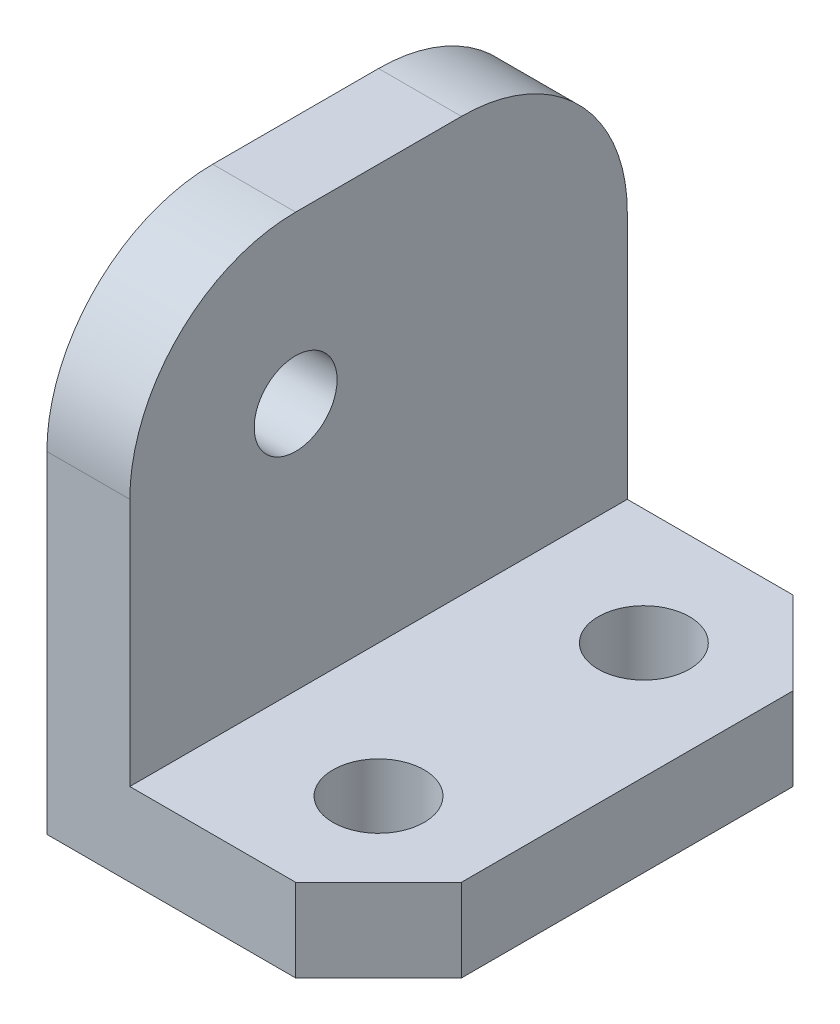
ISO-10303-21;
HEADER;
FILE_DESCRIPTION(('STEP AP214'),'2;1');
FILE_NAME('part.step','',(''),(''),'','','');
FILE_SCHEMA(('AUTOMOTIVE_DESIGN { 1 0 10303 214 1 1 1 1 }'));
ENDSEC;
DATA;
#1=APPLICATION_CONTEXT('core data for automotive mechanical design processes');
#2=APPLICATION_PROTOCOL_DEFINITION('international standard','automotive_design',2000,#1);
#3=PRODUCT_CONTEXT('',#1,'mechanical');
#4=PRODUCT('Part','Part','',(#3));
#5=PRODUCT_RELATED_PRODUCT_CATEGORY('part','',(#4));
#6=PRODUCT_DEFINITION_FORMATION('','',#4);
#7=PRODUCT_DEFINITION_CONTEXT('part definition',#1,'design');
#8=PRODUCT_DEFINITION('design','',#6,#7);
#9=PRODUCT_DEFINITION_SHAPE('','',#8);
#10=(LENGTH_UNIT() NAMED_UNIT(*) SI_UNIT(.MILLI.,.METRE.));
#11=(NAMED_UNIT(*) PLANE_ANGLE_UNIT() SI_UNIT($,.RADIAN.));
#12=(NAMED_UNIT(*) SI_UNIT($,.STERADIAN.) SOLID_ANGLE_UNIT());
#13=UNCERTAINTY_MEASURE_WITH_UNIT(LENGTH_MEASURE(1.E-05),#10,'distance_accuracy_value','');
#14=(GEOMETRIC_REPRESENTATION_CONTEXT(3) GLOBAL_UNCERTAINTY_ASSIGNED_CONTEXT((#13)) GLOBAL_UNIT_ASSIGNED_CONTEXT((#10,
#11,#12)) REPRESENTATION_CONTEXT('',''));
#15=CARTESIAN_POINT('',(0.,0.,0.));
#16=DIRECTION('',(0.,0.,1.));
#17=DIRECTION('',(1.,0.,0.));
#18=AXIS2_PLACEMENT_3D('',#15,#16,#17);
#19=CARTESIAN_POINT('',(20.,0.,30.));
#20=DIRECTION('',(0.,1.,0.));
#21=DIRECTION('',(-1.,0.,0.));
#22=AXIS2_PLACEMENT_3D('',#19,#20,#21);
#23=PLANE('',#22);
#24=CARTESIAN_POINT('',(13.,0.,7.));
#25=DIRECTION('',(0.,1.,0.));
#26=DIRECTION('',(0.,0.,1.));
#27=AXIS2_PLACEMENT_3D('',#24,#25,#26);
#28=CIRCLE('',#27,2.75);
#29=CARTESIAN_POINT('',(13.,0.,9.75));
#30=VERTEX_POINT('',#29);
#31=EDGE_CURVE('E168',#30,#30,#28,.T.);
#32=ORIENTED_EDGE('',*,*,#31,.T.);
#33=EDGE_LOOP('',(#32));
#34=FACE_BOUND('',#33,.T.);
#35=CARTESIAN_POINT('',(13.,0.,23.));
#36=DIRECTION('',(0.,1.,0.));
#37=DIRECTION('',(0.,0.,1.));
#38=AXIS2_PLACEMENT_3D('',#35,#36,#37);
#39=CIRCLE('',#38,2.75);
#40=CARTESIAN_POINT('',(13.,0.,25.75));
#41=VERTEX_POINT('',#40);
#42=EDGE_CURVE('E176',#41,#41,#39,.T.);
#43=ORIENTED_EDGE('',*,*,#42,.T.);
#44=EDGE_LOOP('',(#43));
#45=FACE_BOUND('',#44,.T.);
#46=DIRECTION('',(1.,0.,0.));
#47=VECTOR('',#46,1.);
#48=CARTESIAN_POINT('',(20.,0.,0.));
#49=LINE('',#48,#47);
#50=CARTESIAN_POINT('',(0.,0.,0.));
#51=VERTEX_POINT('',#50);
#52=CARTESIAN_POINT('',(15.,0.,0.));
#53=VERTEX_POINT('',#52);
#54=EDGE_CURVE('E188',#51,#53,#49,.T.);
#55=ORIENTED_EDGE('',*,*,#54,.T.);
#56=DIRECTION('',(0.707106781186549,0.,0.707106781186547));
#57=VECTOR('',#56,1.);
#58=CARTESIAN_POINT('',(20.,0.,5.));
#59=LINE('',#58,#57);
#60=CARTESIAN_POINT('',(20.,0.,5.));
#61=VERTEX_POINT('',#60);
#62=EDGE_CURVE('E55',#53,#61,#59,.T.);
#63=ORIENTED_EDGE('',*,*,#62,.T.);
#64=DIRECTION('',(0.,0.,-1.));
#65=VECTOR('',#64,1.);
#66=CARTESIAN_POINT('',(20.,0.,30.));
#67=LINE('',#66,#65);
#68=CARTESIAN_POINT('',(20.,0.,25.));
#69=VERTEX_POINT('',#68);
#70=EDGE_CURVE('E225',#69,#61,#67,.T.);
#71=ORIENTED_EDGE('',*,*,#70,.F.);
#72=DIRECTION('',(0.707106781186546,0.,-0.707106781186549));
#73=VECTOR('',#72,1.);
#74=CARTESIAN_POINT('',(15.,0.,30.));
#75=LINE('',#74,#73);
#76=CARTESIAN_POINT('',(15.,0.,30.));
#77=VERTEX_POINT('',#76);
#78=EDGE_CURVE('E62',#69,#77,#75,.F.);
#79=ORIENTED_EDGE('',*,*,#78,.T.);
#80=DIRECTION('',(1.,0.,0.));
#81=VECTOR('',#80,1.);
#82=CARTESIAN_POINT('',(20.,0.,30.));
#83=LINE('',#82,#81);
#84=CARTESIAN_POINT('',(0.,0.,30.));
#85=VERTEX_POINT('',#84);
#86=EDGE_CURVE('E189',#85,#77,#83,.T.);
#87=ORIENTED_EDGE('',*,*,#86,.F.);
#88=DIRECTION('',(0.,0.,-1.));
#89=VECTOR('',#88,1.);
#90=CARTESIAN_POINT('',(0.,0.,30.));
#91=LINE('',#90,#89);
#92=EDGE_CURVE('E202',#85,#51,#91,.T.);
#93=ORIENTED_EDGE('',*,*,#92,.T.);
#94=EDGE_LOOP('',(#55,#63,#71,#79,#87,#93));
#95=FACE_BOUND('',#94,.T.);
#96=ADVANCED_FACE('F45',(#34,#45,#95),#23,.F.);
#97=CARTESIAN_POINT('',(20.,5.,30.));
#98=DIRECTION('',(-1.,0.,0.));
#99=DIRECTION('',(0.,0.,1.));
#100=AXIS2_PLACEMENT_3D('',#97,#98,#99);
#101=PLANE('',#100);
#102=ORIENTED_EDGE('',*,*,#70,.T.);
#103=DIRECTION('',(0.,1.,0.));
#104=VECTOR('',#103,1.);
#105=CARTESIAN_POINT('',(20.,5.,5.));
#106=LINE('',#105,#104);
#107=CARTESIAN_POINT('',(20.,5.,5.));
#108=VERTEX_POINT('',#107);
#109=EDGE_CURVE('E244',#61,#108,#106,.T.);
#110=ORIENTED_EDGE('',*,*,#109,.T.);
#111=DIRECTION('',(0.,0.,-1.));
#112=VECTOR('',#111,1.);
#113=CARTESIAN_POINT('',(20.,5.,30.));
#114=LINE('',#113,#112);
#115=CARTESIAN_POINT('',(20.,5.,25.));
#116=VERTEX_POINT('',#115);
#117=EDGE_CURVE('E221',#116,#108,#114,.T.);
#118=ORIENTED_EDGE('',*,*,#117,.F.);
#119=DIRECTION('',(0.,-1.,0.));
#120=VECTOR('',#119,1.);
#121=CARTESIAN_POINT('',(20.,5.,25.));
#122=LINE('',#121,#120);
#123=EDGE_CURVE('E241',#116,#69,#122,.T.);
#124=ORIENTED_EDGE('',*,*,#123,.T.);
#125=EDGE_LOOP('',(#102,#110,#118,#124));
#126=FACE_BOUND('',#125,.T.);
#127=ADVANCED_FACE('F262',(#126),#101,.F.);
#128=CARTESIAN_POINT('',(5.,5.,30.));
#129=DIRECTION('',(0.,-1.,0.));
#130=DIRECTION('',(0.,0.,-1.));
#131=AXIS2_PLACEMENT_3D('',#128,#129,#130);
#132=PLANE('',#131);
#133=CARTESIAN_POINT('',(13.,5.,7.));
#134=DIRECTION('',(0.,1.,0.));
#135=DIRECTION('',(0.,0.,1.));
#136=AXIS2_PLACEMENT_3D('',#133,#134,#135);
#137=CIRCLE('',#136,2.75);
#138=CARTESIAN_POINT('',(13.,5.,9.75));
#139=VERTEX_POINT('',#138);
#140=EDGE_CURVE('E163',#139,#139,#137,.T.);
#141=ORIENTED_EDGE('',*,*,#140,.F.);
#142=EDGE_LOOP('',(#141));
#143=FACE_BOUND('',#142,.T.);
#144=CARTESIAN_POINT('',(13.,5.,23.));
#145=DIRECTION('',(0.,1.,0.));
#146=DIRECTION('',(0.,0.,1.));
#147=AXIS2_PLACEMENT_3D('',#144,#145,#146);
#148=CIRCLE('',#147,2.75);
#149=CARTESIAN_POINT('',(13.,5.,25.75));
#150=VERTEX_POINT('',#149);
#151=EDGE_CURVE('E172',#150,#150,#148,.T.);
#152=ORIENTED_EDGE('',*,*,#151,.F.);
#153=EDGE_LOOP('',(#152));
#154=FACE_BOUND('',#153,.T.);
#155=ORIENTED_EDGE('',*,*,#117,.T.);
#156=DIRECTION('',(-0.707106781186549,0.,-0.707106781186547));
#157=VECTOR('',#156,1.);
#158=CARTESIAN_POINT('',(20.,5.,5.));
#159=LINE('',#158,#157);
#160=CARTESIAN_POINT('',(15.,5.,0.));
#161=VERTEX_POINT('',#160);
#162=EDGE_CURVE('E251',#108,#161,#159,.T.);
#163=ORIENTED_EDGE('',*,*,#162,.T.);
#164=DIRECTION('',(-1.,0.,0.));
#165=VECTOR('',#164,1.);
#166=CARTESIAN_POINT('',(5.,5.,0.));
#167=LINE('',#166,#165);
#168=CARTESIAN_POINT('',(5.,5.,0.));
#169=VERTEX_POINT('',#168);
#170=EDGE_CURVE('E205',#161,#169,#167,.T.);
#171=ORIENTED_EDGE('',*,*,#170,.T.);
#172=DIRECTION('',(0.,0.,-1.));
#173=VECTOR('',#172,1.);
#174=CARTESIAN_POINT('',(5.,5.,30.));
#175=LINE('',#174,#173);
#176=CARTESIAN_POINT('',(5.,5.,30.));
#177=VERTEX_POINT('',#176);
#178=EDGE_CURVE('E217',#177,#169,#175,.T.);
#179=ORIENTED_EDGE('',*,*,#178,.F.);
#180=DIRECTION('',(-1.,0.,0.));
#181=VECTOR('',#180,1.);
#182=CARTESIAN_POINT('',(5.,5.,30.));
#183=LINE('',#182,#181);
#184=CARTESIAN_POINT('',(15.,5.,30.));
#185=VERTEX_POINT('',#184);
#186=EDGE_CURVE('E192',#185,#177,#183,.T.);
#187=ORIENTED_EDGE('',*,*,#186,.F.);
#188=DIRECTION('',(-0.707106781186546,0.,0.707106781186549));
#189=VECTOR('',#188,1.);
#190=CARTESIAN_POINT('',(15.,5.,30.));
#191=LINE('',#190,#189);
#192=EDGE_CURVE('E248',#185,#116,#191,.F.);
#193=ORIENTED_EDGE('',*,*,#192,.T.);
#194=EDGE_LOOP('',(#155,#163,#171,#179,#187,#193));
#195=FACE_BOUND('',#194,.T.);
#196=ADVANCED_FACE('F267',(#143,#154,#195),#132,.F.);
#197=CARTESIAN_POINT('',(5.,38.,30.));
#198=DIRECTION('',(-1.,0.,0.));
#199=DIRECTION('',(0.,-1.,0.));
#200=AXIS2_PLACEMENT_3D('',#197,#198,#199);
#201=PLANE('',#200);
#202=CARTESIAN_POINT('',(5.,20.,20.));
#203=DIRECTION('',(1.,0.,0.));
#204=DIRECTION('',(0.,0.,-1.));
#205=AXIS2_PLACEMENT_3D('',#202,#203,#204);
#206=CIRCLE('',#205,2.5);
#207=CARTESIAN_POINT('',(5.,20.,17.5));
#208=VERTEX_POINT('',#207);
#209=EDGE_CURVE('E180',#208,#208,#206,.T.);
#210=ORIENTED_EDGE('',*,*,#209,.F.);
#211=EDGE_LOOP('',(#210));
#212=FACE_BOUND('',#211,.T.);
#213=DIRECTION('',(0.,1.,0.));
#214=VECTOR('',#213,1.);
#215=CARTESIAN_POINT('',(5.,38.,0.));
#216=LINE('',#215,#214);
#217=CARTESIAN_POINT('',(5.,20.,0.));
#218=VERTEX_POINT('',#217);
#219=EDGE_CURVE('E208',#169,#218,#216,.T.);
#220=ORIENTED_EDGE('',*,*,#219,.T.);
#221=CARTESIAN_POINT('',(5.,20.,10.));
#222=DIRECTION('',(-1.,0.,0.));
#223=DIRECTION('',(0.,-1.,0.));
#224=AXIS2_PLACEMENT_3D('',#221,#222,#223);
#225=CIRCLE('',#224,10.);
#226=CARTESIAN_POINT('',(5.,30.,10.));
#227=VERTEX_POINT('',#226);
#228=EDGE_CURVE('E233',#218,#227,#225,.F.);
#229=ORIENTED_EDGE('',*,*,#228,.T.);
#230=DIRECTION('',(0.,0.,-1.));
#231=VECTOR('',#230,1.);
#232=CARTESIAN_POINT('',(5.,30.,20.));
#233=LINE('',#232,#231);
#234=CARTESIAN_POINT('',(5.,30.,20.));
#235=VERTEX_POINT('',#234);
#236=EDGE_CURVE('E155',#235,#227,#233,.T.);
#237=ORIENTED_EDGE('',*,*,#236,.F.);
#238=CARTESIAN_POINT('',(5.,20.,20.));
#239=DIRECTION('',(-1.,0.,0.));
#240=DIRECTION('',(0.,1.,0.));
#241=AXIS2_PLACEMENT_3D('',#238,#239,#240);
#242=CIRCLE('',#241,10.);
#243=CARTESIAN_POINT('',(5.,20.,30.));
#244=VERTEX_POINT('',#243);
#245=EDGE_CURVE('E134',#244,#235,#242,.T.);
#246=ORIENTED_EDGE('',*,*,#245,.F.);
#247=DIRECTION('',(0.,1.,0.));
#248=VECTOR('',#247,1.);
#249=CARTESIAN_POINT('',(5.,38.,30.));
#250=LINE('',#249,#248);
#251=EDGE_CURVE('E196',#177,#244,#250,.T.);
#252=ORIENTED_EDGE('',*,*,#251,.F.);
#253=ORIENTED_EDGE('',*,*,#178,.T.);
#254=EDGE_LOOP('',(#220,#229,#237,#246,#252,#253));
#255=FACE_BOUND('',#254,.T.);
#256=ADVANCED_FACE('F274',(#212,#255),#201,.F.);
#257=CARTESIAN_POINT('',(0.,0.,30.));
#258=DIRECTION('',(1.,0.,0.));
#259=DIRECTION('',(0.,0.,-1.));
#260=AXIS2_PLACEMENT_3D('',#257,#258,#259);
#261=PLANE('',#260);
#262=CARTESIAN_POINT('',(0.,20.,20.));
#263=DIRECTION('',(1.,0.,0.));
#264=DIRECTION('',(0.,0.,-1.));
#265=AXIS2_PLACEMENT_3D('',#262,#263,#264);
#266=CIRCLE('',#265,2.5);
#267=CARTESIAN_POINT('',(0.,20.,17.5));
#268=VERTEX_POINT('',#267);
#269=EDGE_CURVE('E184',#268,#268,#266,.T.);
#270=ORIENTED_EDGE('',*,*,#269,.T.);
#271=EDGE_LOOP('',(#270));
#272=FACE_BOUND('',#271,.T.);
#273=DIRECTION('',(0.,0.,-1.));
#274=VECTOR('',#273,1.);
#275=CARTESIAN_POINT('',(0.,30.,20.));
#276=LINE('',#275,#274);
#277=CARTESIAN_POINT('',(0.,30.,20.));
#278=VERTEX_POINT('',#277);
#279=CARTESIAN_POINT('',(0.,30.,10.));
#280=VERTEX_POINT('',#279);
#281=EDGE_CURVE('E140',#278,#280,#276,.T.);
#282=ORIENTED_EDGE('',*,*,#281,.T.);
#283=CARTESIAN_POINT('',(0.,20.,10.));
#284=DIRECTION('',(1.,0.,0.));
#285=DIRECTION('',(0.,0.,-1.));
#286=AXIS2_PLACEMENT_3D('',#283,#284,#285);
#287=CIRCLE('',#286,10.);
#288=CARTESIAN_POINT('',(0.,20.,0.));
#289=VERTEX_POINT('',#288);
#290=EDGE_CURVE('E238',#280,#289,#287,.F.);
#291=ORIENTED_EDGE('',*,*,#290,.T.);
#292=DIRECTION('',(0.,-1.,0.));
#293=VECTOR('',#292,1.);
#294=CARTESIAN_POINT('',(0.,0.,0.));
#295=LINE('',#294,#293);
#296=EDGE_CURVE('E193',#289,#51,#295,.T.);
#297=ORIENTED_EDGE('',*,*,#296,.T.);
#298=ORIENTED_EDGE('',*,*,#92,.F.);
#299=DIRECTION('',(0.,-1.,0.));
#300=VECTOR('',#299,1.);
#301=CARTESIAN_POINT('',(0.,0.,30.));
#302=LINE('',#301,#300);
#303=CARTESIAN_POINT('',(0.,20.,30.));
#304=VERTEX_POINT('',#303);
#305=EDGE_CURVE('E153',#304,#85,#302,.T.);
#306=ORIENTED_EDGE('',*,*,#305,.F.);
#307=CARTESIAN_POINT('',(0.,20.,20.));
#308=DIRECTION('',(-1.,0.,0.));
#309=DIRECTION('',(0.,1.,0.));
#310=AXIS2_PLACEMENT_3D('',#307,#308,#309);
#311=CIRCLE('',#310,10.);
#312=EDGE_CURVE('E131',#304,#278,#311,.T.);
#313=ORIENTED_EDGE('',*,*,#312,.T.);
#314=EDGE_LOOP('',(#282,#291,#297,#298,#306,#313));
#315=FACE_BOUND('',#314,.T.);
#316=ADVANCED_FACE('F151',(#272,#315),#261,.F.);
#317=CARTESIAN_POINT('',(0.,0.,30.));
#318=DIRECTION('',(0.,0.,-1.));
#319=DIRECTION('',(-1.,0.,0.));
#320=AXIS2_PLACEMENT_3D('',#317,#318,#319);
#321=PLANE('',#320);
#322=ORIENTED_EDGE('',*,*,#86,.T.);
#323=DIRECTION('',(0.,1.,0.));
#324=VECTOR('',#323,1.);
#325=CARTESIAN_POINT('',(15.,0.,30.));
#326=LINE('',#325,#324);
#327=EDGE_CURVE('E11',#77,#185,#326,.T.);
#328=ORIENTED_EDGE('',*,*,#327,.T.);
#329=ORIENTED_EDGE('',*,*,#186,.T.);
#330=ORIENTED_EDGE('',*,*,#251,.T.);
#331=DIRECTION('',(1.,0.,0.));
#332=VECTOR('',#331,1.);
#333=CARTESIAN_POINT('',(0.,20.,30.));
#334=LINE('',#333,#332);
#335=EDGE_CURVE('E139',#304,#244,#334,.T.);
#336=ORIENTED_EDGE('',*,*,#335,.F.);
#337=ORIENTED_EDGE('',*,*,#305,.T.);
#338=EDGE_LOOP('',(#322,#328,#329,#330,#336,#337));
#339=FACE_BOUND('',#338,.T.);
#340=ADVANCED_FACE('F278',(#339),#321,.F.);
#341=CARTESIAN_POINT('',(0.,0.,0.));
#342=DIRECTION('',(0.,0.,-1.));
#343=DIRECTION('',(-1.,0.,0.));
#344=AXIS2_PLACEMENT_3D('',#341,#342,#343);
#345=PLANE('',#344);
#346=ORIENTED_EDGE('',*,*,#170,.F.);
#347=DIRECTION('',(0.,-1.,0.));
#348=VECTOR('',#347,1.);
#349=CARTESIAN_POINT('',(15.,0.,0.));
#350=LINE('',#349,#348);
#351=EDGE_CURVE('E70',#161,#53,#350,.T.);
#352=ORIENTED_EDGE('',*,*,#351,.T.);
#353=ORIENTED_EDGE('',*,*,#54,.F.);
#354=ORIENTED_EDGE('',*,*,#296,.F.);
#355=DIRECTION('',(1.,0.,0.));
#356=VECTOR('',#355,1.);
#357=CARTESIAN_POINT('',(5.,20.,0.));
#358=LINE('',#357,#356);
#359=EDGE_CURVE('E229',#289,#218,#358,.T.);
#360=ORIENTED_EDGE('',*,*,#359,.T.);
#361=ORIENTED_EDGE('',*,*,#219,.F.);
#362=EDGE_LOOP('',(#346,#352,#353,#354,#360,#361));
#363=FACE_BOUND('',#362,.T.);
#364=ADVANCED_FACE('F270',(#363),#345,.T.);
#365=CARTESIAN_POINT('',(5.,20.,20.));
#366=DIRECTION('',(1.,0.,0.));
#367=DIRECTION('',(0.,0.,-1.));
#368=AXIS2_PLACEMENT_3D('',#365,#366,#367);
#369=CYLINDRICAL_SURFACE('',#368,2.5);
#370=ORIENTED_EDGE('',*,*,#269,.F.);
#371=EDGE_LOOP('',(#370));
#372=FACE_BOUND('',#371,.T.);
#373=ORIENTED_EDGE('',*,*,#209,.T.);
#374=EDGE_LOOP('',(#373));
#375=FACE_BOUND('',#374,.T.);
#376=ADVANCED_FACE('F319',(#372,#375),#369,.F.);
#377=CARTESIAN_POINT('',(13.,5.,23.));
#378=DIRECTION('',(0.,1.,0.));
#379=DIRECTION('',(0.,0.,1.));
#380=AXIS2_PLACEMENT_3D('',#377,#378,#379);
#381=CYLINDRICAL_SURFACE('',#380,2.75);
#382=ORIENTED_EDGE('',*,*,#42,.F.);
#383=EDGE_LOOP('',(#382));
#384=FACE_BOUND('',#383,.T.);
#385=ORIENTED_EDGE('',*,*,#151,.T.);
#386=EDGE_LOOP('',(#385));
#387=FACE_BOUND('',#386,.T.);
#388=ADVANCED_FACE('F315',(#384,#387),#381,.F.);
#389=CARTESIAN_POINT('',(13.,5.,7.));
#390=DIRECTION('',(0.,1.,0.));
#391=DIRECTION('',(0.,0.,1.));
#392=AXIS2_PLACEMENT_3D('',#389,#390,#391);
#393=CYLINDRICAL_SURFACE('',#392,2.75);
#394=ORIENTED_EDGE('',*,*,#31,.F.);
#395=EDGE_LOOP('',(#394));
#396=FACE_BOUND('',#395,.T.);
#397=ORIENTED_EDGE('',*,*,#140,.T.);
#398=EDGE_LOOP('',(#397));
#399=FACE_BOUND('',#398,.T.);
#400=ADVANCED_FACE('F310',(#396,#399),#393,.F.);
#401=CARTESIAN_POINT('',(0.,20.,20.));
#402=DIRECTION('',(1.,0.,0.));
#403=DIRECTION('',(0.,1.,0.));
#404=AXIS2_PLACEMENT_3D('',#401,#402,#403);
#405=CYLINDRICAL_SURFACE('',#404,10.);
#406=ORIENTED_EDGE('',*,*,#245,.T.);
#407=DIRECTION('',(1.,0.,0.));
#408=VECTOR('',#407,1.);
#409=CARTESIAN_POINT('',(0.,30.,20.));
#410=LINE('',#409,#408);
#411=EDGE_CURVE('E127',#278,#235,#410,.T.);
#412=ORIENTED_EDGE('',*,*,#411,.F.);
#413=ORIENTED_EDGE('',*,*,#312,.F.);
#414=ORIENTED_EDGE('',*,*,#335,.T.);
#415=EDGE_LOOP('',(#406,#412,#413,#414));
#416=FACE_BOUND('',#415,.T.);
#417=ADVANCED_FACE('F129',(#416),#405,.T.);
#418=CARTESIAN_POINT('',(0.,30.,20.));
#419=DIRECTION('',(0.,-1.,0.));
#420=DIRECTION('',(1.,0.,0.));
#421=AXIS2_PLACEMENT_3D('',#418,#419,#420);
#422=PLANE('',#421);
#423=ORIENTED_EDGE('',*,*,#236,.T.);
#424=DIRECTION('',(1.,0.,0.));
#425=VECTOR('',#424,1.);
#426=CARTESIAN_POINT('',(0.,30.,10.));
#427=LINE('',#426,#425);
#428=EDGE_CURVE('E145',#227,#280,#427,.F.);
#429=ORIENTED_EDGE('',*,*,#428,.T.);
#430=ORIENTED_EDGE('',*,*,#281,.F.);
#431=ORIENTED_EDGE('',*,*,#411,.T.);
#432=EDGE_LOOP('',(#423,#429,#430,#431));
#433=FACE_BOUND('',#432,.T.);
#434=ADVANCED_FACE('F143',(#433),#422,.F.);
#435=CARTESIAN_POINT('',(0.,20.,10.));
#436=DIRECTION('',(-1.,0.,0.));
#437=DIRECTION('',(0.,-1.,0.));
#438=AXIS2_PLACEMENT_3D('',#435,#436,#437);
#439=CYLINDRICAL_SURFACE('',#438,10.);
#440=ORIENTED_EDGE('',*,*,#290,.F.);
#441=ORIENTED_EDGE('',*,*,#428,.F.);
#442=ORIENTED_EDGE('',*,*,#228,.F.);
#443=ORIENTED_EDGE('',*,*,#359,.F.);
#444=EDGE_LOOP('',(#440,#441,#442,#443));
#445=FACE_BOUND('',#444,.T.);
#446=ADVANCED_FACE('F285',(#445),#439,.T.);
#447=CARTESIAN_POINT('',(20.,5.,5.));
#448=DIRECTION('',(0.707106781186547,0.,-0.707106781186549));
#449=DIRECTION('',(0.,-1.,0.));
#450=AXIS2_PLACEMENT_3D('',#447,#448,#449);
#451=PLANE('',#450);
#452=ORIENTED_EDGE('',*,*,#62,.F.);
#453=ORIENTED_EDGE('',*,*,#351,.F.);
#454=ORIENTED_EDGE('',*,*,#162,.F.);
#455=ORIENTED_EDGE('',*,*,#109,.F.);
#456=EDGE_LOOP('',(#452,#453,#454,#455));
#457=FACE_BOUND('',#456,.T.);
#458=ADVANCED_FACE('F265',(#457),#451,.T.);
#459=CARTESIAN_POINT('',(15.,0.,30.));
#460=DIRECTION('',(-0.707106781186549,0.,-0.707106781186546));
#461=DIRECTION('',(0.,1.,0.));
#462=AXIS2_PLACEMENT_3D('',#459,#460,#461);
#463=PLANE('',#462);
#464=ORIENTED_EDGE('',*,*,#78,.F.);
#465=ORIENTED_EDGE('',*,*,#123,.F.);
#466=ORIENTED_EDGE('',*,*,#192,.F.);
#467=ORIENTED_EDGE('',*,*,#327,.F.);
#468=EDGE_LOOP('',(#464,#465,#466,#467));
#469=FACE_BOUND('',#468,.T.);
#470=ADVANCED_FACE('F48',(#469),#463,.F.);
#471=CLOSED_SHELL('',(#96,#127,#196,#256,#316,#340,#364,#376,#388,#400,#417,#434,#446,#458,#470));
#472=MANIFOLD_SOLID_BREP('B2',#471);
#473=ADVANCED_BREP_SHAPE_REPRESENTATION('',(#18,#472),#14);
#474=SHAPE_DEFINITION_REPRESENTATION(#9,#473);
ENDSEC;
END-ISO-10303-21;
